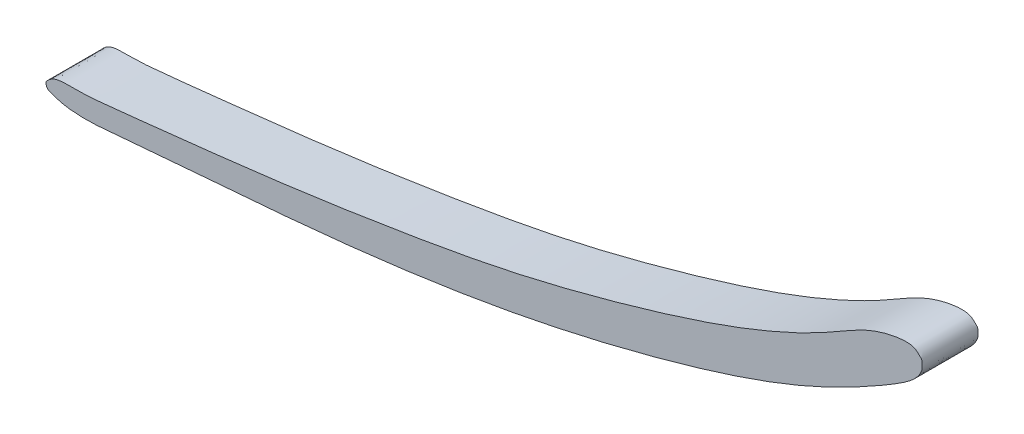
ISO-10303-21;
HEADER;
FILE_DESCRIPTION(('STEP AP214'),'2;1');
FILE_NAME('part.step','',(''),(''),'','','');
FILE_SCHEMA(('AUTOMOTIVE_DESIGN { 1 0 10303 214 1 1 1 1 }'));
ENDSEC;
DATA;
#1=APPLICATION_CONTEXT('core data for automotive mechanical design processes');
#2=APPLICATION_PROTOCOL_DEFINITION('international standard','automotive_design',2000,#1);
#3=PRODUCT_CONTEXT('',#1,'mechanical');
#4=PRODUCT('Part','Part','',(#3));
#5=PRODUCT_RELATED_PRODUCT_CATEGORY('part','',(#4));
#6=PRODUCT_DEFINITION_FORMATION('','',#4);
#7=PRODUCT_DEFINITION_CONTEXT('part definition',#1,'design');
#8=PRODUCT_DEFINITION('design','',#6,#7);
#9=PRODUCT_DEFINITION_SHAPE('','',#8);
#10=(LENGTH_UNIT() NAMED_UNIT(*) SI_UNIT(.MILLI.,.METRE.));
#11=(NAMED_UNIT(*) PLANE_ANGLE_UNIT() SI_UNIT($,.RADIAN.));
#12=(NAMED_UNIT(*) SI_UNIT($,.STERADIAN.) SOLID_ANGLE_UNIT());
#13=UNCERTAINTY_MEASURE_WITH_UNIT(LENGTH_MEASURE(1.E-05),#10,'distance_accuracy_value','');
#14=(GEOMETRIC_REPRESENTATION_CONTEXT(3) GLOBAL_UNCERTAINTY_ASSIGNED_CONTEXT((#13)) GLOBAL_UNIT_ASSIGNED_CONTEXT((#10,
#11,#12)) REPRESENTATION_CONTEXT('',''));
#15=CARTESIAN_POINT('',(0.,0.,0.));
#16=DIRECTION('',(0.,0.,1.));
#17=DIRECTION('',(1.,0.,0.));
#18=AXIS2_PLACEMENT_3D('',#15,#16,#17);
#19=CARTESIAN_POINT('',(73.5363134433803,0.,356.));
#20=CARTESIAN_POINT('',(73.506744334041,0.0829429044658552,356.));
#21=CARTESIAN_POINT('',(73.4489298833481,0.149133029580146,356.));
#22=CARTESIAN_POINT('',(73.3284023490832,0.274158700428943,356.));
#23=CARTESIAN_POINT('',(73.2644925604556,0.332904903431012,356.));
#24=CARTESIAN_POINT('',(73.0762566459582,0.512752527708113,356.));
#25=CARTESIAN_POINT('',(72.951308429586,0.634711271523996,356.));
#26=CARTESIAN_POINT('',(72.7467501427691,0.792872055751912,356.));
#27=CARTESIAN_POINT('',(72.6761514476743,0.84183561864951,356.));
#28=CARTESIAN_POINT('',(72.5262156457711,0.926156019239226,356.));
#29=CARTESIAN_POINT('',(72.446541860511,0.962057692633153,356.));
#30=CARTESIAN_POINT('',(72.2004592653625,1.05141316198334,356.));
#31=CARTESIAN_POINT('',(72.0315172817056,1.08573129174704,356.));
#32=CARTESIAN_POINT('',(71.6888756984179,1.12978352199964,356.));
#33=CARTESIAN_POINT('',(71.5145859177857,1.1387937710922,356.));
#34=CARTESIAN_POINT('',(71.1694772498624,1.14361758598982,356.));
#35=CARTESIAN_POINT('',(70.9976743020295,1.139105198757,356.));
#36=CARTESIAN_POINT('',(70.4842674094948,1.10711933553817,356.));
#37=CARTESIAN_POINT('',(70.1445079555927,1.0626482103464,356.));
#38=CARTESIAN_POINT('',(69.1288044256003,0.896291468796724,356.));
#39=CARTESIAN_POINT('',(68.4555945149131,0.735843946658324,356.));
#40=CARTESIAN_POINT('',(67.1472826170252,0.345921321790186,356.));
#41=CARTESIAN_POINT('',(66.5087693181576,0.113418144024602,356.));
#42=CARTESIAN_POINT('',(64.6384104354066,-0.692524393225826,356.));
#43=CARTESIAN_POINT('',(63.447518472189,-1.36528233783874,356.));
#44=CARTESIAN_POINT('',(61.6697971553349,-2.3913139017302,356.));
#45=CARTESIAN_POINT('',(61.0780336434343,-2.7349728781041,356.));
#46=CARTESIAN_POINT('',(59.8876795443708,-3.40840131200504,356.));
#47=CARTESIAN_POINT('',(59.2896975721064,-3.73940898176464,356.));
#48=CARTESIAN_POINT('',(57.4805859241807,-4.70157767930726,356.));
#49=CARTESIAN_POINT('',(56.2547511856154,-5.30282161367877,356.));
#50=CARTESIAN_POINT('',(53.7763224209403,-6.4508683616781,356.));
#51=CARTESIAN_POINT('',(52.523926971607,-6.9980751749361,356.));
#52=CARTESIAN_POINT('',(49.9999103821698,-8.05337460041552,356.));
#53=CARTESIAN_POINT('',(48.7274266627124,-8.56026997356111,356.));
#54=CARTESIAN_POINT('',(46.1675917292856,-9.5294691882893,356.));
#55=CARTESIAN_POINT('',(44.8798888557767,-9.99299748190295,356.));
#56=CARTESIAN_POINT('',(40.9991997128673,-11.3360004299359,356.));
#57=CARTESIAN_POINT('',(38.3918214707133,-12.1693209671273,356.));
#58=CARTESIAN_POINT('',(33.1542069714321,-13.7570965908598,356.));
#59=CARTESIAN_POINT('',(30.5225819142433,-14.5103740414146,356.));
#60=CARTESIAN_POINT('',(25.2407938973897,-15.95008399691,356.));
#61=CARTESIAN_POINT('',(22.591441653244,-16.6358425683656,356.));
#62=CARTESIAN_POINT('',(17.2703283473567,-17.9170264343776,356.));
#63=CARTESIAN_POINT('',(14.5972198277282,-18.5109161558079,356.));
#64=CARTESIAN_POINT('',(9.23277169350934,-19.6009313990171,356.));
#65=CARTESIAN_POINT('',(6.54183212418728,-20.0994579917113,356.));
#66=CARTESIAN_POINT('',(1.14905349781331,-21.0383826387878,356.));
#67=CARTESIAN_POINT('',(-1.55269796253048,-21.4797338245854,356.));
#68=CARTESIAN_POINT('',(-6.96065480440668,-22.3292452063791,356.));
#69=CARTESIAN_POINT('',(-9.66737363437718,-22.7360042429957,356.));
#70=CARTESIAN_POINT('',(-15.0875281806941,-23.5054115719873,356.));
#71=CARTESIAN_POINT('',(-17.8009072708029,-23.8671291743368,356.));
#72=CARTESIAN_POINT('',(-23.2326189962467,-24.5479255620564,356.));
#73=CARTESIAN_POINT('',(-25.9511434945228,-24.8669088177923,356.));
#74=CARTESIAN_POINT('',(-31.390678340448,-25.4848541219566,356.));
#75=CARTESIAN_POINT('',(-34.1114421030815,-25.7849629546847,356.));
#76=CARTESIAN_POINT('',(-38.1929335748447,-26.2319104188277,356.));
#77=CARTESIAN_POINT('',(-39.553476061535,-26.380546069492,356.));
#78=CARTESIAN_POINT('',(-41.5952108357846,-26.594730793577,356.));
#79=CARTESIAN_POINT('',(-42.2758896402976,-26.6651634732455,356.));
#80=CARTESIAN_POINT('',(-43.6374285138252,-26.8042941330579,356.));
#81=CARTESIAN_POINT('',(-44.3181882055909,-26.8741013951711,356.));
#82=CARTESIAN_POINT('',(-45.6817756826457,-26.9873437758497,356.));
#83=CARTESIAN_POINT('',(-46.3649937963524,-27.0292818044657,356.));
#84=CARTESIAN_POINT('',(-47.3916199342033,-27.0578553974427,356.));
#85=CARTESIAN_POINT('',(-47.7339636386064,-27.0611967354222,356.));
#86=CARTESIAN_POINT('',(-48.4188569999394,-27.0584459172206,356.));
#87=CARTESIAN_POINT('',(-48.7613744915289,-27.0538270692578,356.));
#88=CARTESIAN_POINT('',(-49.4458434758789,-27.0705145063231,356.));
#89=CARTESIAN_POINT('',(-49.7901719334511,-27.0894628295897,356.));
#90=CARTESIAN_POINT('',(-50.296357252494,-27.169585914876,356.));
#91=CARTESIAN_POINT('',(-50.4629009989195,-27.2054228745771,356.));
#92=CARTESIAN_POINT('',(-50.7888732427591,-27.3068295680388,356.));
#93=CARTESIAN_POINT('',(-50.9500586873624,-27.3738536805724,356.));
#94=CARTESIAN_POINT('',(-51.2488253504512,-27.5390254554463,356.));
#95=CARTESIAN_POINT('',(-51.3888908495403,-27.6350446309898,356.));
#96=CARTESIAN_POINT('',(-51.5908814917729,-27.7907619295046,356.));
#97=CARTESIAN_POINT('',(-51.6566587697127,-27.8449065252159,356.));
#98=CARTESIAN_POINT('',(-51.7824577818453,-27.9614933414068,356.));
#99=CARTESIAN_POINT('',(-51.8432013796576,-28.0242464826413,356.));
#100=CARTESIAN_POINT('',(-51.9196036273646,-28.1289816428942,356.));
#101=CARTESIAN_POINT('',(-51.9424101255994,-28.1664978607744,356.));
#102=CARTESIAN_POINT('',(-51.9762111826362,-28.2455741144925,356.));
#103=CARTESIAN_POINT('',(-51.9870222256982,-28.2882554757643,356.));
#104=CARTESIAN_POINT('',(-52.0008885596612,-28.4170644153464,356.));
#105=CARTESIAN_POINT('',(-51.9886628561108,-28.5041820989602,356.));
#106=CARTESIAN_POINT('',(-51.9501975133276,-28.6715148241208,356.));
#107=CARTESIAN_POINT('',(-51.9233746784379,-28.7528741863941,356.));
#108=CARTESIAN_POINT('',(-51.8490455276535,-28.9093062483359,356.));
#109=CARTESIAN_POINT('',(-51.7999104977653,-28.982951259917,356.));
#110=CARTESIAN_POINT('',(-51.6676275699874,-29.0939738610502,356.));
#111=CARTESIAN_POINT('',(-51.5869035703931,-29.128411248575,356.));
#112=CARTESIAN_POINT('',(-51.4232643790643,-29.1862059115054,356.));
#113=CARTESIAN_POINT('',(-51.3403401209049,-29.2120950541036,356.));
#114=CARTESIAN_POINT('',(-51.0944598907384,-29.2976597702024,356.));
#115=CARTESIAN_POINT('',(-50.932858569163,-29.3610476244398,356.));
#116=CARTESIAN_POINT('',(-50.6085902555735,-29.4849074811177,356.));
#117=CARTESIAN_POINT('',(-50.4458213443679,-29.544245354506,356.));
#118=CARTESIAN_POINT('',(-50.1170195621223,-29.6470239752045,356.));
#119=CARTESIAN_POINT('',(-49.9509932660213,-29.6906950728624,356.));
#120=CARTESIAN_POINT('',(-49.4497917392142,-29.8068805607938,356.));
#121=CARTESIAN_POINT('',(-49.1112992593638,-29.8636430401357,356.));
#122=CARTESIAN_POINT('',(-48.4299903515524,-29.9566357919958,356.));
#123=CARTESIAN_POINT('',(-48.0861093154921,-29.9916338103074,356.));
#124=CARTESIAN_POINT('',(-47.0557470171996,-30.0639923970421,356.));
#125=CARTESIAN_POINT('',(-46.3695653898358,-30.0680414809281,356.));
#126=CARTESIAN_POINT('',(-44.9979868060744,-30.0284160734576,356.));
#127=CARTESIAN_POINT('',(-44.3125547464913,-29.9868765527901,356.));
#128=CARTESIAN_POINT('',(-42.9419957387448,-29.8852406788114,356.));
#129=CARTESIAN_POINT('',(-42.257065815999,-29.825037102346,356.));
#130=CARTESIAN_POINT('',(-40.887950236109,-29.7006343093666,356.));
#131=CARTESIAN_POINT('',(-40.203624019116,-29.6358059097121,356.));
#132=CARTESIAN_POINT('',(-38.1504568346334,-29.4434542669293,356.));
#133=CARTESIAN_POINT('',(-36.7813388673514,-29.3191322559235,356.));
#134=CARTESIAN_POINT('',(-32.672215231669,-28.9665400758448,356.));
#135=CARTESIAN_POINT('',(-29.930780727935,-28.7547206674884,356.));
#136=CARTESIAN_POINT('',(-24.4483613827387,-28.3259535684458,356.));
#137=CARTESIAN_POINT('',(-21.7074587217853,-28.1080057831216,356.));
#138=CARTESIAN_POINT('',(-13.4901053678763,-27.3919981394482,356.));
#139=CARTESIAN_POINT('',(-8.0174700977178,-26.8345875715251,356.));
#140=CARTESIAN_POINT('',(2.89070738198345,-25.4516504149665,356.));
#141=CARTESIAN_POINT('',(8.33072432495121,-24.6316481155519,356.));
#142=CARTESIAN_POINT('',(19.1501967745881,-22.6534180504385,356.));
#143=CARTESIAN_POINT('',(24.5300021650533,-21.4926386590999,356.));
#144=CARTESIAN_POINT('',(32.5370388695455,-19.5133312749043,356.));
#145=CARTESIAN_POINT('',(35.1955805399924,-18.8159956820454,356.));
#146=CARTESIAN_POINT('',(40.4885920678477,-17.3349592457176,356.));
#147=CARTESIAN_POINT('',(43.123066013014,-16.5512730683747,356.));
#148=CARTESIAN_POINT('',(48.3568792910885,-14.8578441683048,356.));
#149=CARTESIAN_POINT('',(50.9528109405561,-13.9483042060365,356.));
#150=CARTESIAN_POINT('',(54.7934615302633,-12.4446763712041,356.));
#151=CARTESIAN_POINT('',(56.0656567445061,-11.9197215710841,356.));
#152=CARTESIAN_POINT('',(58.5858454399513,-10.8174902429058,356.));
#153=CARTESIAN_POINT('',(59.8338794305175,-10.240287546312,356.));
#154=CARTESIAN_POINT('',(63.5407206452005,-8.42808295620891,356.));
#155=CARTESIAN_POINT('',(65.9602108539395,-7.11262707800342,356.));
#156=CARTESIAN_POINT('',(68.9230091778711,-5.36586339013585,356.));
#157=CARTESIAN_POINT('',(69.5127600983736,-5.01137540979091,356.));
#158=CARTESIAN_POINT('',(70.3851976620109,-4.46071456854687,356.));
#159=CARTESIAN_POINT('',(70.6735823469337,-4.27335090183009,356.));
#160=CARTESIAN_POINT('',(71.2416055978977,-3.88489810578965,356.));
#161=CARTESIAN_POINT('',(71.5211830269428,-3.68490353832279,356.));
#162=CARTESIAN_POINT('',(72.0598837205124,-3.26096048576403,356.));
#163=CARTESIAN_POINT('',(72.3191192958952,-3.03692148803771,356.));
#164=CARTESIAN_POINT('',(72.8023392236893,-2.54678686967543,356.));
#165=CARTESIAN_POINT('',(73.0244446556854,-2.27920718145445,356.));
#166=CARTESIAN_POINT('',(73.3010026038604,-1.84378045331724,356.));
#167=CARTESIAN_POINT('',(73.3852319421582,-1.69116664797972,356.));
#168=CARTESIAN_POINT('',(73.518997817681,-1.37261803377376,356.));
#169=CARTESIAN_POINT('',(73.5695682700509,-1.20656120600298,356.));
#170=CARTESIAN_POINT('',(73.6060890085674,-0.860291616231157,356.));
#171=CARTESIAN_POINT('',(73.5895865732944,-0.687902181836652,356.));
#172=CARTESIAN_POINT('',(73.5701407174115,-0.429204224058751,356.));
#173=CARTESIAN_POINT('',(73.5675372556954,-0.342889833383531,356.));
#174=CARTESIAN_POINT('',(73.5641233799846,-0.170211681942904,356.));
#175=CARTESIAN_POINT('',(73.5658825527195,-0.0829429044658454,356.));
#176=CARTESIAN_POINT('',(73.5363134433803,0.,356.));
#177=B_SPLINE_CURVE_WITH_KNOTS('',3,(#19,#20,#21,#22,#23,#24,#25,#26,#27,#28,#29,#30,#31,#32,
#33,#34,#35,#36,#37,#38,#39,#40,#41,#42,#43,#44,#45,#46,#47,#48,#49,#50,#51,#52,#53,#54,#55,#56,
#57,#58,#59,#60,#61,#62,#63,#64,#65,#66,#67,#68,#69,#70,#71,#72,#73,#74,#75,#76,#77,#78,#79,#80,
#81,#82,#83,#84,#85,#86,#87,#88,#89,#90,#91,#92,#93,#94,#95,#96,#97,#98,#99,#100,#101,#102,#103,
#104,#105,#106,#107,#108,#109,#110,#111,#112,#113,#114,#115,#116,#117,#118,#119,#120,#121,#122,
#123,#124,#125,#126,#127,#128,#129,#130,#131,#132,#133,#134,#135,#136,#137,#138,#139,#140,#141,
#142,#143,#144,#145,#146,#147,#148,#149,#150,#151,#152,#153,#154,#155,#156,#157,#158,#159,#160,
#161,#162,#163,#164,#165,#166,#167,#168,#169,#170,#171,#172,#173,#174,#175,#176),.UNSPECIFIED.,
.T.,.F.,(4,2,2,2,2,2,2,2,2,2,2,2,2,2,2,2,2,2,2,2,2,2,2,2,2,2,2,2,2,2,2,2,2,2,2,2,2,2,2,2,2,2,2,
2,2,2,2,2,2,2,2,2,2,2,2,2,2,2,2,2,2,2,2,2,2,2,2,2,2,2,2,2,2,2,2,2,2,2,4),(0.,
0.000976562499999839,0.00195312499999968,0.00390624999999935,0.00488281249999925,
0.00585937499999916,0.0078124999999991,0.00976562499999905,0.011718749999999,0.0156249999999991,
0.0234374999999993,0.0312499999999996,0.046875,0.0546875000000002,0.0625000000000004,
0.0781250000000008,0.0937500000000012,0.109375000000002,0.125000000000002,0.156250000000003,
0.187500000000003,0.218750000000004,0.250000000000005,0.281250000000005,0.312500000000006,
0.343750000000007,0.375000000000007,0.406250000000008,0.437500000000009,0.453125000000009,
0.460937500000009,0.468750000000009,0.47656250000001,0.48046875000001,0.48437500000001,
0.48828125000001,0.49023437500001,0.49218750000001,0.49414062500001,0.49511718750001,
0.49609375000001,0.49658203125001,0.49707031250001,0.49804687500001,0.49902343750001,
0.50000000000001,0.50097656250001,0.50195312500001,0.50390625000001,0.50585937500001,
0.50781250000001,0.51171875000001,0.515625000000009,0.523437500000009,0.531250000000009,
0.539062500000009,0.546875000000009,0.562500000000008,0.593750000000008,0.625000000000007,
0.687500000000006,0.750000000000005,0.812500000000003,0.843750000000003,0.875000000000002,
0.906250000000002,0.921875000000001,0.937500000000001,0.96875,0.9765625,0.98046875,0.984375,
0.98828125,0.9921875,0.994140625,0.99609375,0.998046875,0.9990234375,1.),.UNSPECIFIED.);
#178=DIRECTION('',(0.,0.,-1.));
#179=VECTOR('',#178,1.);
#180=SURFACE_OF_LINEAR_EXTRUSION('',#177,#179);
#181=CARTESIAN_POINT('',(73.5363134433803,0.,356.));
#182=CARTESIAN_POINT('',(73.5658825527195,-0.0829429044658454,356.));
#183=CARTESIAN_POINT('',(73.5641233799846,-0.170211681942904,356.));
#184=CARTESIAN_POINT('',(73.5675372556954,-0.342889833383531,356.));
#185=CARTESIAN_POINT('',(73.5701407174115,-0.429204224058751,356.));
#186=CARTESIAN_POINT('',(73.5895865732944,-0.687902181836652,356.));
#187=CARTESIAN_POINT('',(73.6060890085674,-0.860291616231157,356.));
#188=CARTESIAN_POINT('',(73.5695682700509,-1.20656120600298,356.));
#189=CARTESIAN_POINT('',(73.518997817681,-1.37261803377376,356.));
#190=CARTESIAN_POINT('',(73.3852319421582,-1.69116664797972,356.));
#191=CARTESIAN_POINT('',(73.3010026038604,-1.84378045331724,356.));
#192=CARTESIAN_POINT('',(73.0244446556854,-2.27920718145445,356.));
#193=CARTESIAN_POINT('',(72.8023392236893,-2.54678686967543,356.));
#194=CARTESIAN_POINT('',(72.3191192958952,-3.03692148803771,356.));
#195=CARTESIAN_POINT('',(72.0598837205124,-3.26096048576403,356.));
#196=CARTESIAN_POINT('',(71.5211830269428,-3.68490353832279,356.));
#197=CARTESIAN_POINT('',(71.2416055978977,-3.88489810578965,356.));
#198=CARTESIAN_POINT('',(70.6735823469337,-4.27335090183009,356.));
#199=CARTESIAN_POINT('',(70.3851976620109,-4.46071456854687,356.));
#200=CARTESIAN_POINT('',(69.5127600983736,-5.01137540979091,356.));
#201=CARTESIAN_POINT('',(68.9230091778711,-5.36586339013585,356.));
#202=CARTESIAN_POINT('',(65.9602108539395,-7.11262707800342,356.));
#203=CARTESIAN_POINT('',(63.5407206452005,-8.42808295620891,356.));
#204=CARTESIAN_POINT('',(59.8338794305175,-10.240287546312,356.));
#205=CARTESIAN_POINT('',(58.5858454399513,-10.8174902429058,356.));
#206=CARTESIAN_POINT('',(56.0656567445061,-11.9197215710841,356.));
#207=CARTESIAN_POINT('',(54.7934615302633,-12.4446763712041,356.));
#208=CARTESIAN_POINT('',(50.9528109405561,-13.9483042060365,356.));
#209=CARTESIAN_POINT('',(48.3568792910885,-14.8578441683048,356.));
#210=CARTESIAN_POINT('',(43.123066013014,-16.5512730683747,356.));
#211=CARTESIAN_POINT('',(40.4885920678477,-17.3349592457176,356.));
#212=CARTESIAN_POINT('',(35.1955805399924,-18.8159956820454,356.));
#213=CARTESIAN_POINT('',(32.5370388695455,-19.5133312749043,356.));
#214=CARTESIAN_POINT('',(24.5300021650533,-21.4926386590999,356.));
#215=CARTESIAN_POINT('',(19.1501967745881,-22.6534180504385,356.));
#216=CARTESIAN_POINT('',(8.33072432495121,-24.6316481155519,356.));
#217=CARTESIAN_POINT('',(2.89070738198345,-25.4516504149665,356.));
#218=CARTESIAN_POINT('',(-8.0174700977178,-26.8345875715251,356.));
#219=CARTESIAN_POINT('',(-13.4901053678763,-27.3919981394482,356.));
#220=CARTESIAN_POINT('',(-21.7074587217853,-28.1080057831216,356.));
#221=CARTESIAN_POINT('',(-24.4483613827387,-28.3259535684458,356.));
#222=CARTESIAN_POINT('',(-29.930780727935,-28.7547206674884,356.));
#223=CARTESIAN_POINT('',(-32.672215231669,-28.9665400758448,356.));
#224=CARTESIAN_POINT('',(-36.7813388673514,-29.3191322559235,356.));
#225=CARTESIAN_POINT('',(-38.1504568346334,-29.4434542669293,356.));
#226=CARTESIAN_POINT('',(-40.203624019116,-29.6358059097121,356.));
#227=CARTESIAN_POINT('',(-40.887950236109,-29.7006343093666,356.));
#228=CARTESIAN_POINT('',(-42.257065815999,-29.825037102346,356.));
#229=CARTESIAN_POINT('',(-42.9419957387448,-29.8852406788114,356.));
#230=CARTESIAN_POINT('',(-44.3125547464913,-29.9868765527901,356.));
#231=CARTESIAN_POINT('',(-44.9979868060744,-30.0284160734576,356.));
#232=CARTESIAN_POINT('',(-46.3695653898358,-30.0680414809281,356.));
#233=CARTESIAN_POINT('',(-47.0557470171996,-30.0639923970421,356.));
#234=CARTESIAN_POINT('',(-48.0861093154921,-29.9916338103074,356.));
#235=CARTESIAN_POINT('',(-48.4299903515524,-29.9566357919958,356.));
#236=CARTESIAN_POINT('',(-49.1112992593638,-29.8636430401357,356.));
#237=CARTESIAN_POINT('',(-49.4497917392142,-29.8068805607938,356.));
#238=CARTESIAN_POINT('',(-49.9509932660213,-29.6906950728624,356.));
#239=CARTESIAN_POINT('',(-50.1170195621223,-29.6470239752045,356.));
#240=CARTESIAN_POINT('',(-50.4458213443679,-29.544245354506,356.));
#241=CARTESIAN_POINT('',(-50.6085902555735,-29.4849074811177,356.));
#242=CARTESIAN_POINT('',(-50.932858569163,-29.3610476244398,356.));
#243=CARTESIAN_POINT('',(-51.0944598907384,-29.2976597702024,356.));
#244=CARTESIAN_POINT('',(-51.3403401209049,-29.2120950541036,356.));
#245=CARTESIAN_POINT('',(-51.4232643790643,-29.1862059115054,356.));
#246=CARTESIAN_POINT('',(-51.5869035703931,-29.128411248575,356.));
#247=CARTESIAN_POINT('',(-51.6676275699874,-29.0939738610502,356.));
#248=CARTESIAN_POINT('',(-51.7999104977653,-28.982951259917,356.));
#249=CARTESIAN_POINT('',(-51.8490455276535,-28.9093062483359,356.));
#250=CARTESIAN_POINT('',(-51.9233746784379,-28.7528741863941,356.));
#251=CARTESIAN_POINT('',(-51.9501975133276,-28.6715148241208,356.));
#252=CARTESIAN_POINT('',(-51.9886628561108,-28.5041820989602,356.));
#253=CARTESIAN_POINT('',(-52.0008885596612,-28.4170644153464,356.));
#254=CARTESIAN_POINT('',(-51.9870222256982,-28.2882554757643,356.));
#255=CARTESIAN_POINT('',(-51.9762111826362,-28.2455741144925,356.));
#256=CARTESIAN_POINT('',(-51.9424101255994,-28.1664978607744,356.));
#257=CARTESIAN_POINT('',(-51.9196036273646,-28.1289816428942,356.));
#258=CARTESIAN_POINT('',(-51.8432013796576,-28.0242464826413,356.));
#259=CARTESIAN_POINT('',(-51.7824577818453,-27.9614933414068,356.));
#260=CARTESIAN_POINT('',(-51.6566587697127,-27.8449065252159,356.));
#261=CARTESIAN_POINT('',(-51.5908814917729,-27.7907619295046,356.));
#262=CARTESIAN_POINT('',(-51.3888908495403,-27.6350446309898,356.));
#263=CARTESIAN_POINT('',(-51.2488253504512,-27.5390254554463,356.));
#264=CARTESIAN_POINT('',(-50.9500586873624,-27.3738536805724,356.));
#265=CARTESIAN_POINT('',(-50.7888732427591,-27.3068295680388,356.));
#266=CARTESIAN_POINT('',(-50.4629009989195,-27.2054228745771,356.));
#267=CARTESIAN_POINT('',(-50.296357252494,-27.169585914876,356.));
#268=CARTESIAN_POINT('',(-49.7901719334511,-27.0894628295897,356.));
#269=CARTESIAN_POINT('',(-49.4458434758789,-27.0705145063231,356.));
#270=CARTESIAN_POINT('',(-48.7613744915289,-27.0538270692578,356.));
#271=CARTESIAN_POINT('',(-48.4188569999394,-27.0584459172206,356.));
#272=CARTESIAN_POINT('',(-47.7339636386064,-27.0611967354222,356.));
#273=CARTESIAN_POINT('',(-47.3916199342033,-27.0578553974427,356.));
#274=CARTESIAN_POINT('',(-46.3649937963524,-27.0292818044657,356.));
#275=CARTESIAN_POINT('',(-45.6817756826457,-26.9873437758497,356.));
#276=CARTESIAN_POINT('',(-44.3181882055909,-26.8741013951711,356.));
#277=CARTESIAN_POINT('',(-43.6374285138252,-26.8042941330579,356.));
#278=CARTESIAN_POINT('',(-42.2758896402976,-26.6651634732455,356.));
#279=CARTESIAN_POINT('',(-41.5952108357846,-26.594730793577,356.));
#280=CARTESIAN_POINT('',(-39.553476061535,-26.380546069492,356.));
#281=CARTESIAN_POINT('',(-38.1929335748447,-26.2319104188277,356.));
#282=CARTESIAN_POINT('',(-34.1114421030815,-25.7849629546847,356.));
#283=CARTESIAN_POINT('',(-31.390678340448,-25.4848541219566,356.));
#284=CARTESIAN_POINT('',(-25.9511434945228,-24.8669088177923,356.));
#285=CARTESIAN_POINT('',(-23.2326189962467,-24.5479255620564,356.));
#286=CARTESIAN_POINT('',(-17.8009072708029,-23.8671291743368,356.));
#287=CARTESIAN_POINT('',(-15.0875281806941,-23.5054115719873,356.));
#288=CARTESIAN_POINT('',(-9.66737363437718,-22.7360042429957,356.));
#289=CARTESIAN_POINT('',(-6.96065480440668,-22.3292452063791,356.));
#290=CARTESIAN_POINT('',(-1.55269796253048,-21.4797338245854,356.));
#291=CARTESIAN_POINT('',(1.14905349781331,-21.0383826387878,356.));
#292=CARTESIAN_POINT('',(6.54183212418728,-20.0994579917113,356.));
#293=CARTESIAN_POINT('',(9.23277169350934,-19.6009313990171,356.));
#294=CARTESIAN_POINT('',(14.5972198277282,-18.5109161558079,356.));
#295=CARTESIAN_POINT('',(17.2703283473567,-17.9170264343776,356.));
#296=CARTESIAN_POINT('',(22.591441653244,-16.6358425683656,356.));
#297=CARTESIAN_POINT('',(25.2407938973897,-15.95008399691,356.));
#298=CARTESIAN_POINT('',(30.5225819142433,-14.5103740414146,356.));
#299=CARTESIAN_POINT('',(33.1542069714321,-13.7570965908598,356.));
#300=CARTESIAN_POINT('',(38.3918214707133,-12.1693209671273,356.));
#301=CARTESIAN_POINT('',(40.9991997128673,-11.3360004299359,356.));
#302=CARTESIAN_POINT('',(44.8798888557767,-9.99299748190295,356.));
#303=CARTESIAN_POINT('',(46.1675917292856,-9.5294691882893,356.));
#304=CARTESIAN_POINT('',(48.7274266627124,-8.56026997356111,356.));
#305=CARTESIAN_POINT('',(49.9999103821698,-8.05337460041552,356.));
#306=CARTESIAN_POINT('',(52.523926971607,-6.9980751749361,356.));
#307=CARTESIAN_POINT('',(53.7763224209403,-6.4508683616781,356.));
#308=CARTESIAN_POINT('',(56.2547511856154,-5.30282161367877,356.));
#309=CARTESIAN_POINT('',(57.4805859241807,-4.70157767930726,356.));
#310=CARTESIAN_POINT('',(59.2896975721064,-3.73940898176464,356.));
#311=CARTESIAN_POINT('',(59.8876795443708,-3.40840131200504,356.));
#312=CARTESIAN_POINT('',(61.0780336434343,-2.7349728781041,356.));
#313=CARTESIAN_POINT('',(61.6697971553349,-2.3913139017302,356.));
#314=CARTESIAN_POINT('',(63.447518472189,-1.36528233783874,356.));
#315=CARTESIAN_POINT('',(64.6384104354066,-0.692524393225826,356.));
#316=CARTESIAN_POINT('',(66.5087693181576,0.113418144024602,356.));
#317=CARTESIAN_POINT('',(67.1472826170252,0.345921321790186,356.));
#318=CARTESIAN_POINT('',(68.4555945149131,0.735843946658324,356.));
#319=CARTESIAN_POINT('',(69.1288044256003,0.896291468796724,356.));
#320=CARTESIAN_POINT('',(70.1445079555927,1.0626482103464,356.));
#321=CARTESIAN_POINT('',(70.4842674094948,1.10711933553817,356.));
#322=CARTESIAN_POINT('',(70.9976743020295,1.139105198757,356.));
#323=CARTESIAN_POINT('',(71.1694772498624,1.14361758598982,356.));
#324=CARTESIAN_POINT('',(71.5145859177857,1.1387937710922,356.));
#325=CARTESIAN_POINT('',(71.6888756984179,1.12978352199964,356.));
#326=CARTESIAN_POINT('',(72.0315172817056,1.08573129174704,356.));
#327=CARTESIAN_POINT('',(72.2004592653625,1.05141316198334,356.));
#328=CARTESIAN_POINT('',(72.446541860511,0.962057692633153,356.));
#329=CARTESIAN_POINT('',(72.5262156457711,0.926156019239226,356.));
#330=CARTESIAN_POINT('',(72.6761514476743,0.84183561864951,356.));
#331=CARTESIAN_POINT('',(72.7467501427691,0.792872055751912,356.));
#332=CARTESIAN_POINT('',(72.951308429586,0.634711271523996,356.));
#333=CARTESIAN_POINT('',(73.0762566459582,0.512752527708113,356.));
#334=CARTESIAN_POINT('',(73.2644925604556,0.332904903431012,356.));
#335=CARTESIAN_POINT('',(73.3284023490832,0.274158700428943,356.));
#336=CARTESIAN_POINT('',(73.4489298833481,0.149133029580146,356.));
#337=CARTESIAN_POINT('',(73.506744334041,0.0829429044658552,356.));
#338=CARTESIAN_POINT('',(73.5363134433803,0.,356.));
#339=B_SPLINE_CURVE_WITH_KNOTS('',3,(#181,#182,#183,#184,#185,#186,#187,#188,#189,#190,#191,
#192,#193,#194,#195,#196,#197,#198,#199,#200,#201,#202,#203,#204,#205,#206,#207,#208,#209,#210,
#211,#212,#213,#214,#215,#216,#217,#218,#219,#220,#221,#222,#223,#224,#225,#226,#227,#228,#229,
#230,#231,#232,#233,#234,#235,#236,#237,#238,#239,#240,#241,#242,#243,#244,#245,#246,#247,#248,
#249,#250,#251,#252,#253,#254,#255,#256,#257,#258,#259,#260,#261,#262,#263,#264,#265,#266,#267,
#268,#269,#270,#271,#272,#273,#274,#275,#276,#277,#278,#279,#280,#281,#282,#283,#284,#285,#286,
#287,#288,#289,#290,#291,#292,#293,#294,#295,#296,#297,#298,#299,#300,#301,#302,#303,#304,#305,
#306,#307,#308,#309,#310,#311,#312,#313,#314,#315,#316,#317,#318,#319,#320,#321,#322,#323,#324,
#325,#326,#327,#328,#329,#330,#331,#332,#333,#334,#335,#336,#337,#338),.UNSPECIFIED.,.T.,.F.,(4,
2,2,2,2,2,2,2,2,2,2,2,2,2,2,2,2,2,2,2,2,2,2,2,2,2,2,2,2,2,2,2,2,2,2,2,2,2,2,2,2,2,2,2,2,2,2,2,2,
2,2,2,2,2,2,2,2,2,2,2,2,2,2,2,2,2,2,2,2,2,2,2,2,2,2,2,2,2,4),(0.,0.0009765625,
0.00195312499999989,0.00390624999999989,0.00585937499999989,0.00781249999999989,0.01171875,
0.015625,0.01953125,0.0234375,0.0312499999999999,0.0624999999999991,0.0781249999999988,
0.0937499999999984,0.124999999999998,0.156249999999997,0.187499999999997,0.249999999999995,
0.312499999999994,0.374999999999993,0.406249999999992,0.437499999999992,0.453124999999991,
0.460937499999991,0.468749999999991,0.476562499999991,0.484374999999991,0.48828124999999,
0.49218749999999,0.49414062499999,0.49609374999999,0.49804687499999,0.49902343749999,
0.49999999999999,0.50097656249999,0.50195312499999,0.50292968749999,0.50341796874999,
0.50390624999999,0.50488281249999,0.50585937499999,0.50781249999999,0.50976562499999,
0.51171874999999,0.51562499999999,0.51953124999999,0.52343749999999,0.531249999999991,
0.539062499999991,0.546874999999991,0.562499999999991,0.593749999999992,0.624999999999993,
0.656249999999993,0.687499999999994,0.718749999999995,0.749999999999995,0.781249999999996,
0.812499999999997,0.843749999999997,0.874999999999998,0.890624999999998,0.906249999999999,
0.921874999999999,0.9375,0.9453125,0.953125,0.96875,0.976562500000001,0.984375000000001,
0.988281250000001,0.990234375000001,0.992187500000001,0.994140625000001,0.995117187500001,
0.996093750000001,0.998046875,0.9990234375,1.),.UNSPECIFIED.);
#340=CARTESIAN_POINT('',(73.5363134433803,0.,356.));
#341=VERTEX_POINT('',#340);
#342=EDGE_CURVE('E10',#341,#341,#339,.F.);
#343=ORIENTED_EDGE('',*,*,#342,.F.);
#344=EDGE_LOOP('',(#343));
#345=FACE_BOUND('',#344,.T.);
#346=CARTESIAN_POINT('',(73.5363134433803,0.,348.));
#347=CARTESIAN_POINT('',(73.506744334041,0.0829429044658552,348.));
#348=CARTESIAN_POINT('',(73.4489298833481,0.149133029580146,348.));
#349=CARTESIAN_POINT('',(73.3284023490832,0.274158700428943,348.));
#350=CARTESIAN_POINT('',(73.2644925604556,0.332904903431012,348.));
#351=CARTESIAN_POINT('',(73.0762566459582,0.512752527708113,348.));
#352=CARTESIAN_POINT('',(72.951308429586,0.634711271523996,348.));
#353=CARTESIAN_POINT('',(72.7467501427691,0.792872055751912,348.));
#354=CARTESIAN_POINT('',(72.6761514476743,0.84183561864951,348.));
#355=CARTESIAN_POINT('',(72.5262156457711,0.926156019239226,348.));
#356=CARTESIAN_POINT('',(72.446541860511,0.962057692633153,348.));
#357=CARTESIAN_POINT('',(72.2004592653625,1.05141316198334,348.));
#358=CARTESIAN_POINT('',(72.0315172817056,1.08573129174704,348.));
#359=CARTESIAN_POINT('',(71.6888756984179,1.12978352199964,348.));
#360=CARTESIAN_POINT('',(71.5145859177857,1.1387937710922,348.));
#361=CARTESIAN_POINT('',(71.1694772498624,1.14361758598982,348.));
#362=CARTESIAN_POINT('',(70.9976743020295,1.139105198757,348.));
#363=CARTESIAN_POINT('',(70.4842674094948,1.10711933553817,348.));
#364=CARTESIAN_POINT('',(70.1445079555927,1.0626482103464,348.));
#365=CARTESIAN_POINT('',(69.1288044256003,0.896291468796724,348.));
#366=CARTESIAN_POINT('',(68.4555945149131,0.735843946658324,348.));
#367=CARTESIAN_POINT('',(67.1472826170252,0.345921321790186,348.));
#368=CARTESIAN_POINT('',(66.5087693181576,0.113418144024602,348.));
#369=CARTESIAN_POINT('',(64.6384104354066,-0.692524393225826,348.));
#370=CARTESIAN_POINT('',(63.447518472189,-1.36528233783874,348.));
#371=CARTESIAN_POINT('',(61.6697971553349,-2.3913139017302,348.));
#372=CARTESIAN_POINT('',(61.0780336434343,-2.7349728781041,348.));
#373=CARTESIAN_POINT('',(59.8876795443708,-3.40840131200504,348.));
#374=CARTESIAN_POINT('',(59.2896975721064,-3.73940898176464,348.));
#375=CARTESIAN_POINT('',(57.4805859241807,-4.70157767930726,348.));
#376=CARTESIAN_POINT('',(56.2547511856154,-5.30282161367877,348.));
#377=CARTESIAN_POINT('',(53.7763224209403,-6.4508683616781,348.));
#378=CARTESIAN_POINT('',(52.523926971607,-6.9980751749361,348.));
#379=CARTESIAN_POINT('',(49.9999103821698,-8.05337460041552,348.));
#380=CARTESIAN_POINT('',(48.7274266627124,-8.56026997356111,348.));
#381=CARTESIAN_POINT('',(46.1675917292856,-9.5294691882893,348.));
#382=CARTESIAN_POINT('',(44.8798888557767,-9.99299748190295,348.));
#383=CARTESIAN_POINT('',(40.9991997128673,-11.3360004299359,348.));
#384=CARTESIAN_POINT('',(38.3918214707133,-12.1693209671273,348.));
#385=CARTESIAN_POINT('',(33.1542069714321,-13.7570965908598,348.));
#386=CARTESIAN_POINT('',(30.5225819142433,-14.5103740414146,348.));
#387=CARTESIAN_POINT('',(25.2407938973897,-15.95008399691,348.));
#388=CARTESIAN_POINT('',(22.591441653244,-16.6358425683656,348.));
#389=CARTESIAN_POINT('',(17.2703283473567,-17.9170264343776,348.));
#390=CARTESIAN_POINT('',(14.5972198277282,-18.5109161558079,348.));
#391=CARTESIAN_POINT('',(9.23277169350934,-19.6009313990171,348.));
#392=CARTESIAN_POINT('',(6.54183212418728,-20.0994579917113,348.));
#393=CARTESIAN_POINT('',(1.14905349781331,-21.0383826387878,348.));
#394=CARTESIAN_POINT('',(-1.55269796253048,-21.4797338245854,348.));
#395=CARTESIAN_POINT('',(-6.96065480440668,-22.3292452063791,348.));
#396=CARTESIAN_POINT('',(-9.66737363437718,-22.7360042429957,348.));
#397=CARTESIAN_POINT('',(-15.0875281806941,-23.5054115719873,348.));
#398=CARTESIAN_POINT('',(-17.8009072708029,-23.8671291743368,348.));
#399=CARTESIAN_POINT('',(-23.2326189962467,-24.5479255620564,348.));
#400=CARTESIAN_POINT('',(-25.9511434945228,-24.8669088177923,348.));
#401=CARTESIAN_POINT('',(-31.390678340448,-25.4848541219566,348.));
#402=CARTESIAN_POINT('',(-34.1114421030815,-25.7849629546847,348.));
#403=CARTESIAN_POINT('',(-38.1929335748447,-26.2319104188277,348.));
#404=CARTESIAN_POINT('',(-39.553476061535,-26.380546069492,348.));
#405=CARTESIAN_POINT('',(-41.5952108357846,-26.594730793577,348.));
#406=CARTESIAN_POINT('',(-42.2758896402976,-26.6651634732455,348.));
#407=CARTESIAN_POINT('',(-43.6374285138252,-26.8042941330579,348.));
#408=CARTESIAN_POINT('',(-44.3181882055909,-26.8741013951711,348.));
#409=CARTESIAN_POINT('',(-45.6817756826457,-26.9873437758497,348.));
#410=CARTESIAN_POINT('',(-46.3649937963524,-27.0292818044657,348.));
#411=CARTESIAN_POINT('',(-47.3916199342033,-27.0578553974427,348.));
#412=CARTESIAN_POINT('',(-47.7339636386064,-27.0611967354222,348.));
#413=CARTESIAN_POINT('',(-48.4188569999394,-27.0584459172206,348.));
#414=CARTESIAN_POINT('',(-48.7613744915289,-27.0538270692578,348.));
#415=CARTESIAN_POINT('',(-49.4458434758789,-27.0705145063231,348.));
#416=CARTESIAN_POINT('',(-49.7901719334511,-27.0894628295897,348.));
#417=CARTESIAN_POINT('',(-50.296357252494,-27.169585914876,348.));
#418=CARTESIAN_POINT('',(-50.4629009989195,-27.2054228745771,348.));
#419=CARTESIAN_POINT('',(-50.7888732427591,-27.3068295680388,348.));
#420=CARTESIAN_POINT('',(-50.9500586873624,-27.3738536805724,348.));
#421=CARTESIAN_POINT('',(-51.2488253504512,-27.5390254554463,348.));
#422=CARTESIAN_POINT('',(-51.3888908495403,-27.6350446309898,348.));
#423=CARTESIAN_POINT('',(-51.5908814917729,-27.7907619295046,348.));
#424=CARTESIAN_POINT('',(-51.6566587697127,-27.8449065252159,348.));
#425=CARTESIAN_POINT('',(-51.7824577818453,-27.9614933414068,348.));
#426=CARTESIAN_POINT('',(-51.8432013796576,-28.0242464826413,348.));
#427=CARTESIAN_POINT('',(-51.9196036273646,-28.1289816428942,348.));
#428=CARTESIAN_POINT('',(-51.9424101255994,-28.1664978607744,348.));
#429=CARTESIAN_POINT('',(-51.9762111826362,-28.2455741144925,348.));
#430=CARTESIAN_POINT('',(-51.9870222256982,-28.2882554757643,348.));
#431=CARTESIAN_POINT('',(-52.0008885596612,-28.4170644153464,348.));
#432=CARTESIAN_POINT('',(-51.9886628561108,-28.5041820989602,348.));
#433=CARTESIAN_POINT('',(-51.9501975133276,-28.6715148241208,348.));
#434=CARTESIAN_POINT('',(-51.9233746784379,-28.7528741863941,348.));
#435=CARTESIAN_POINT('',(-51.8490455276535,-28.9093062483359,348.));
#436=CARTESIAN_POINT('',(-51.7999104977653,-28.982951259917,348.));
#437=CARTESIAN_POINT('',(-51.6676275699874,-29.0939738610502,348.));
#438=CARTESIAN_POINT('',(-51.5869035703931,-29.128411248575,348.));
#439=CARTESIAN_POINT('',(-51.4232643790643,-29.1862059115054,348.));
#440=CARTESIAN_POINT('',(-51.3403401209049,-29.2120950541036,348.));
#441=CARTESIAN_POINT('',(-51.0944598907384,-29.2976597702024,348.));
#442=CARTESIAN_POINT('',(-50.932858569163,-29.3610476244398,348.));
#443=CARTESIAN_POINT('',(-50.6085902555735,-29.4849074811177,348.));
#444=CARTESIAN_POINT('',(-50.4458213443679,-29.544245354506,348.));
#445=CARTESIAN_POINT('',(-50.1170195621223,-29.6470239752045,348.));
#446=CARTESIAN_POINT('',(-49.9509932660213,-29.6906950728624,348.));
#447=CARTESIAN_POINT('',(-49.4497917392142,-29.8068805607938,348.));
#448=CARTESIAN_POINT('',(-49.1112992593638,-29.8636430401357,348.));
#449=CARTESIAN_POINT('',(-48.4299903515524,-29.9566357919958,348.));
#450=CARTESIAN_POINT('',(-48.0861093154921,-29.9916338103074,348.));
#451=CARTESIAN_POINT('',(-47.0557470171996,-30.0639923970421,348.));
#452=CARTESIAN_POINT('',(-46.3695653898358,-30.0680414809281,348.));
#453=CARTESIAN_POINT('',(-44.9979868060744,-30.0284160734576,348.));
#454=CARTESIAN_POINT('',(-44.3125547464913,-29.9868765527901,348.));
#455=CARTESIAN_POINT('',(-42.9419957387448,-29.8852406788114,348.));
#456=CARTESIAN_POINT('',(-42.257065815999,-29.825037102346,348.));
#457=CARTESIAN_POINT('',(-40.887950236109,-29.7006343093666,348.));
#458=CARTESIAN_POINT('',(-40.203624019116,-29.6358059097121,348.));
#459=CARTESIAN_POINT('',(-38.1504568346334,-29.4434542669293,348.));
#460=CARTESIAN_POINT('',(-36.7813388673514,-29.3191322559235,348.));
#461=CARTESIAN_POINT('',(-32.672215231669,-28.9665400758448,348.));
#462=CARTESIAN_POINT('',(-29.930780727935,-28.7547206674884,348.));
#463=CARTESIAN_POINT('',(-24.4483613827387,-28.3259535684458,348.));
#464=CARTESIAN_POINT('',(-21.7074587217853,-28.1080057831216,348.));
#465=CARTESIAN_POINT('',(-13.4901053678763,-27.3919981394482,348.));
#466=CARTESIAN_POINT('',(-8.0174700977178,-26.8345875715251,348.));
#467=CARTESIAN_POINT('',(2.89070738198345,-25.4516504149665,348.));
#468=CARTESIAN_POINT('',(8.33072432495121,-24.6316481155519,348.));
#469=CARTESIAN_POINT('',(19.1501967745881,-22.6534180504385,348.));
#470=CARTESIAN_POINT('',(24.5300021650533,-21.4926386590999,348.));
#471=CARTESIAN_POINT('',(32.5370388695455,-19.5133312749043,348.));
#472=CARTESIAN_POINT('',(35.1955805399924,-18.8159956820454,348.));
#473=CARTESIAN_POINT('',(40.4885920678477,-17.3349592457176,348.));
#474=CARTESIAN_POINT('',(43.123066013014,-16.5512730683747,348.));
#475=CARTESIAN_POINT('',(48.3568792910885,-14.8578441683048,348.));
#476=CARTESIAN_POINT('',(50.9528109405561,-13.9483042060365,348.));
#477=CARTESIAN_POINT('',(54.7934615302633,-12.4446763712041,348.));
#478=CARTESIAN_POINT('',(56.0656567445061,-11.9197215710841,348.));
#479=CARTESIAN_POINT('',(58.5858454399513,-10.8174902429058,348.));
#480=CARTESIAN_POINT('',(59.8338794305175,-10.240287546312,348.));
#481=CARTESIAN_POINT('',(63.5407206452005,-8.42808295620891,348.));
#482=CARTESIAN_POINT('',(65.9602108539395,-7.11262707800342,348.));
#483=CARTESIAN_POINT('',(68.9230091778711,-5.36586339013585,348.));
#484=CARTESIAN_POINT('',(69.5127600983736,-5.01137540979091,348.));
#485=CARTESIAN_POINT('',(70.3851976620109,-4.46071456854687,348.));
#486=CARTESIAN_POINT('',(70.6735823469337,-4.27335090183009,348.));
#487=CARTESIAN_POINT('',(71.2416055978977,-3.88489810578965,348.));
#488=CARTESIAN_POINT('',(71.5211830269428,-3.68490353832279,348.));
#489=CARTESIAN_POINT('',(72.0598837205124,-3.26096048576403,348.));
#490=CARTESIAN_POINT('',(72.3191192958952,-3.03692148803771,348.));
#491=CARTESIAN_POINT('',(72.8023392236893,-2.54678686967543,348.));
#492=CARTESIAN_POINT('',(73.0244446556854,-2.27920718145445,348.));
#493=CARTESIAN_POINT('',(73.3010026038604,-1.84378045331724,348.));
#494=CARTESIAN_POINT('',(73.3852319421582,-1.69116664797972,348.));
#495=CARTESIAN_POINT('',(73.518997817681,-1.37261803377376,348.));
#496=CARTESIAN_POINT('',(73.5695682700509,-1.20656120600298,348.));
#497=CARTESIAN_POINT('',(73.6060890085674,-0.860291616231157,348.));
#498=CARTESIAN_POINT('',(73.5895865732944,-0.687902181836652,348.));
#499=CARTESIAN_POINT('',(73.5701407174115,-0.429204224058751,348.));
#500=CARTESIAN_POINT('',(73.5675372556954,-0.342889833383531,348.));
#501=CARTESIAN_POINT('',(73.5641233799846,-0.170211681942904,348.));
#502=CARTESIAN_POINT('',(73.5658825527195,-0.0829429044658454,348.));
#503=CARTESIAN_POINT('',(73.5363134433803,0.,348.));
#504=B_SPLINE_CURVE_WITH_KNOTS('',3,(#346,#347,#348,#349,#350,#351,#352,#353,#354,#355,#356,
#357,#358,#359,#360,#361,#362,#363,#364,#365,#366,#367,#368,#369,#370,#371,#372,#373,#374,#375,
#376,#377,#378,#379,#380,#381,#382,#383,#384,#385,#386,#387,#388,#389,#390,#391,#392,#393,#394,
#395,#396,#397,#398,#399,#400,#401,#402,#403,#404,#405,#406,#407,#408,#409,#410,#411,#412,#413,
#414,#415,#416,#417,#418,#419,#420,#421,#422,#423,#424,#425,#426,#427,#428,#429,#430,#431,#432,
#433,#434,#435,#436,#437,#438,#439,#440,#441,#442,#443,#444,#445,#446,#447,#448,#449,#450,#451,
#452,#453,#454,#455,#456,#457,#458,#459,#460,#461,#462,#463,#464,#465,#466,#467,#468,#469,#470,
#471,#472,#473,#474,#475,#476,#477,#478,#479,#480,#481,#482,#483,#484,#485,#486,#487,#488,#489,
#490,#491,#492,#493,#494,#495,#496,#497,#498,#499,#500,#501,#502,#503),.UNSPECIFIED.,.T.,.F.,(4,
2,2,2,2,2,2,2,2,2,2,2,2,2,2,2,2,2,2,2,2,2,2,2,2,2,2,2,2,2,2,2,2,2,2,2,2,2,2,2,2,2,2,2,2,2,2,2,2,
2,2,2,2,2,2,2,2,2,2,2,2,2,2,2,2,2,2,2,2,2,2,2,2,2,2,2,2,2,4),(0.,0.000976562499999839,
0.00195312499999968,0.00390624999999935,0.00488281249999925,0.00585937499999916,
0.0078124999999991,0.00976562499999905,0.011718749999999,0.0156249999999991,0.0234374999999993,
0.0312499999999996,0.046875,0.0546875000000002,0.0625000000000004,0.0781250000000008,
0.0937500000000012,0.109375000000002,0.125000000000002,0.156250000000003,0.187500000000003,
0.218750000000004,0.250000000000005,0.281250000000005,0.312500000000006,0.343750000000007,
0.375000000000007,0.406250000000008,0.437500000000009,0.453125000000009,0.460937500000009,
0.468750000000009,0.47656250000001,0.48046875000001,0.48437500000001,0.48828125000001,
0.49023437500001,0.49218750000001,0.49414062500001,0.49511718750001,0.49609375000001,
0.49658203125001,0.49707031250001,0.49804687500001,0.49902343750001,0.50000000000001,
0.50097656250001,0.50195312500001,0.50390625000001,0.50585937500001,0.50781250000001,
0.51171875000001,0.515625000000009,0.523437500000009,0.531250000000009,0.539062500000009,
0.546875000000009,0.562500000000008,0.593750000000008,0.625000000000007,0.687500000000006,
0.750000000000005,0.812500000000003,0.843750000000003,0.875000000000002,0.906250000000002,
0.921875000000001,0.937500000000001,0.96875,0.9765625,0.98046875,0.984375,0.98828125,0.9921875,
0.994140625,0.99609375,0.998046875,0.9990234375,1.),.UNSPECIFIED.);
#505=CARTESIAN_POINT('',(73.5363134433803,0.,348.));
#506=VERTEX_POINT('',#505);
#507=EDGE_CURVE('E38',#506,#506,#504,.T.);
#508=ORIENTED_EDGE('',*,*,#507,.T.);
#509=EDGE_LOOP('',(#508));
#510=FACE_BOUND('',#509,.T.);
#511=ADVANCED_FACE('F28',(#345,#510),#180,.F.);
#512=CARTESIAN_POINT('',(-51.7337690338784,-29.0384625604819,356.));
#513=DIRECTION('',(0.,0.,-1.));
#514=DIRECTION('',(-1.,0.,0.));
#515=AXIS2_PLACEMENT_3D('',#512,#513,#514);
#516=PLANE('',#515);
#517=ORIENTED_EDGE('',*,*,#342,.T.);
#518=EDGE_LOOP('',(#517));
#519=FACE_BOUND('',#518,.T.);
#520=ADVANCED_FACE('F69',(#519),#516,.F.);
#521=CARTESIAN_POINT('',(-51.7337690338784,-29.0384625604819,348.));
#522=DIRECTION('',(0.,0.,-1.));
#523=DIRECTION('',(-1.,0.,0.));
#524=AXIS2_PLACEMENT_3D('',#521,#522,#523);
#525=PLANE('',#524);
#526=ORIENTED_EDGE('',*,*,#507,.F.);
#527=EDGE_LOOP('',(#526));
#528=FACE_BOUND('',#527,.T.);
#529=ADVANCED_FACE('F77',(#528),#525,.T.);
#530=CLOSED_SHELL('',(#511,#520,#529));
#531=MANIFOLD_SOLID_BREP('B2',#530);
#532=ADVANCED_BREP_SHAPE_REPRESENTATION('',(#18,#531),#14);
#533=SHAPE_DEFINITION_REPRESENTATION(#9,#532);
ENDSEC;
END-ISO-10303-21;
